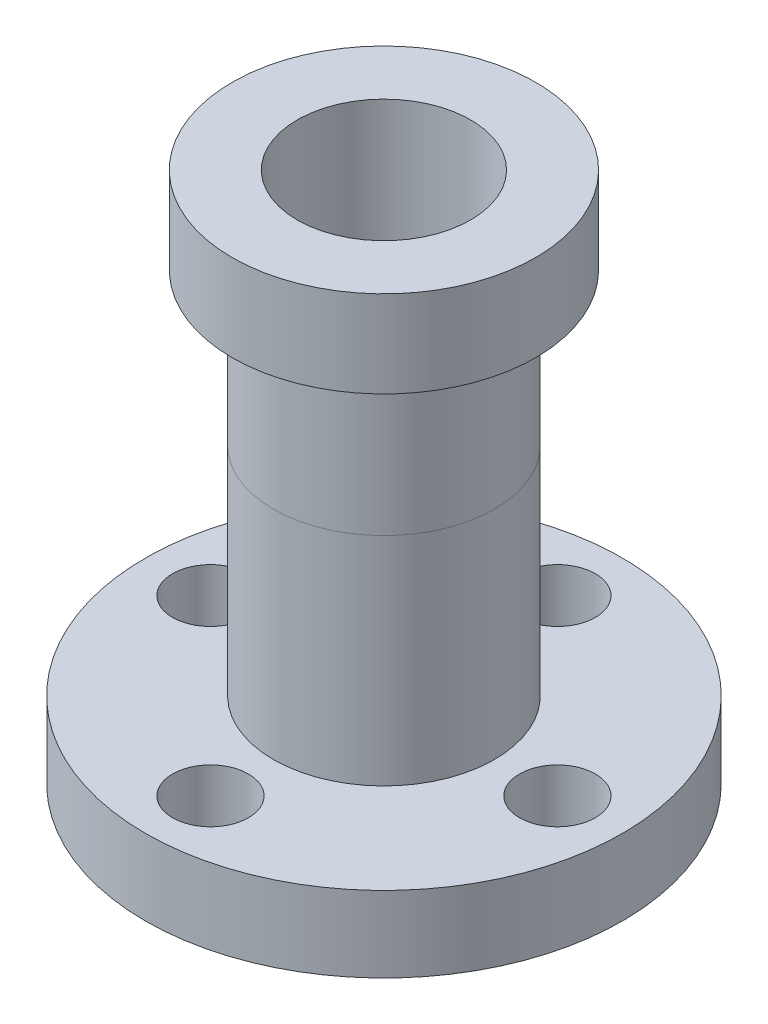
ISO-10303-21;
HEADER;
FILE_DESCRIPTION(('STEP AP214'),'2;1');
FILE_NAME('part.step','',(''),(''),'','','');
FILE_SCHEMA(('AUTOMOTIVE_DESIGN { 1 0 10303 214 1 1 1 1 }'));
ENDSEC;
DATA;
#1=APPLICATION_CONTEXT('core data for automotive mechanical design processes');
#2=APPLICATION_PROTOCOL_DEFINITION('international standard','automotive_design',2000,#1);
#3=PRODUCT_CONTEXT('',#1,'mechanical');
#4=PRODUCT('Part','Part','',(#3));
#5=PRODUCT_RELATED_PRODUCT_CATEGORY('part','',(#4));
#6=PRODUCT_DEFINITION_FORMATION('','',#4);
#7=PRODUCT_DEFINITION_CONTEXT('part definition',#1,'design');
#8=PRODUCT_DEFINITION('design','',#6,#7);
#9=PRODUCT_DEFINITION_SHAPE('','',#8);
#10=(LENGTH_UNIT() NAMED_UNIT(*) SI_UNIT(.MILLI.,.METRE.));
#11=(NAMED_UNIT(*) PLANE_ANGLE_UNIT() SI_UNIT($,.RADIAN.));
#12=(NAMED_UNIT(*) SI_UNIT($,.STERADIAN.) SOLID_ANGLE_UNIT());
#13=UNCERTAINTY_MEASURE_WITH_UNIT(LENGTH_MEASURE(1.E-05),#10,'distance_accuracy_value','');
#14=(GEOMETRIC_REPRESENTATION_CONTEXT(3) GLOBAL_UNCERTAINTY_ASSIGNED_CONTEXT((#13)) GLOBAL_UNIT_ASSIGNED_CONTEXT((#10,
#11,#12)) REPRESENTATION_CONTEXT('',''));
#15=CARTESIAN_POINT('',(0.,0.,0.));
#16=DIRECTION('',(0.,0.,1.));
#17=DIRECTION('',(1.,0.,0.));
#18=AXIS2_PLACEMENT_3D('',#15,#16,#17);
#19=CARTESIAN_POINT('',(0.,26.,0.));
#20=DIRECTION('',(0.,-1.,0.));
#21=DIRECTION('',(0.,0.,-1.));
#22=AXIS2_PLACEMENT_3D('',#19,#20,#21);
#23=CYLINDRICAL_SURFACE('',#22,5.1);
#24=CARTESIAN_POINT('',(0.,15.,0.));
#25=DIRECTION('',(0.,1.,0.));
#26=DIRECTION('',(0.,0.,1.));
#27=AXIS2_PLACEMENT_3D('',#24,#25,#26);
#28=CIRCLE('',#27,5.1);
#29=CARTESIAN_POINT('',(0.,15.,5.1));
#30=VERTEX_POINT('',#29);
#31=EDGE_CURVE('P0_E21',#30,#30,#28,.T.);
#32=ORIENTED_EDGE('',*,*,#31,.T.);
#33=EDGE_LOOP('',(#32));
#34=FACE_BOUND('',#33,.T.);
#35=CARTESIAN_POINT('',(0.,22.,0.));
#36=DIRECTION('',(0.,1.,0.));
#37=DIRECTION('',(0.,0.,1.));
#38=AXIS2_PLACEMENT_3D('',#35,#36,#37);
#39=CIRCLE('',#38,5.1);
#40=CARTESIAN_POINT('',(0.,22.,5.1));
#41=VERTEX_POINT('',#40);
#42=EDGE_CURVE('P0_E10',#41,#41,#39,.T.);
#43=ORIENTED_EDGE('',*,*,#42,.F.);
#44=EDGE_LOOP('',(#43));
#45=FACE_BOUND('',#44,.T.);
#46=ADVANCED_FACE('P0_F15',(#34,#45),#23,.T.);
#47=CARTESIAN_POINT('',(0.,26.,0.));
#48=DIRECTION('',(0.,1.,0.));
#49=DIRECTION('',(0.,0.,1.));
#50=AXIS2_PLACEMENT_3D('',#47,#48,#49);
#51=PLANE('',#50);
#52=CARTESIAN_POINT('',(0.,26.,0.));
#53=DIRECTION('',(0.,1.,0.));
#54=DIRECTION('',(0.,0.,1.));
#55=AXIS2_PLACEMENT_3D('',#52,#53,#54);
#56=CIRCLE('',#55,4.);
#57=CARTESIAN_POINT('',(0.,26.,4.));
#58=VERTEX_POINT('',#57);
#59=EDGE_CURVE('P0_E25',#58,#58,#56,.T.);
#60=ORIENTED_EDGE('',*,*,#59,.F.);
#61=EDGE_LOOP('',(#60));
#62=FACE_BOUND('',#61,.T.);
#63=CARTESIAN_POINT('',(0.,26.,0.));
#64=DIRECTION('',(0.,1.,0.));
#65=DIRECTION('',(0.,0.,1.));
#66=AXIS2_PLACEMENT_3D('',#63,#64,#65);
#67=CIRCLE('',#66,7.);
#68=CARTESIAN_POINT('',(0.,26.,7.));
#69=VERTEX_POINT('',#68);
#70=EDGE_CURVE('P0_E35',#69,#69,#67,.T.);
#71=ORIENTED_EDGE('',*,*,#70,.T.);
#72=EDGE_LOOP('',(#71));
#73=FACE_BOUND('',#72,.T.);
#74=ADVANCED_FACE('P0_F55',(#62,#73),#51,.T.);
#75=CARTESIAN_POINT('',(0.,15.,0.));
#76=DIRECTION('',(0.,1.,0.));
#77=DIRECTION('',(0.,0.,1.));
#78=AXIS2_PLACEMENT_3D('',#75,#76,#77);
#79=PLANE('',#78);
#80=ORIENTED_EDGE('',*,*,#31,.F.);
#81=EDGE_LOOP('',(#80));
#82=FACE_BOUND('',#81,.T.);
#83=CARTESIAN_POINT('',(0.,15.,0.));
#84=DIRECTION('',(0.,1.,0.));
#85=DIRECTION('',(0.,0.,1.));
#86=AXIS2_PLACEMENT_3D('',#83,#84,#85);
#87=CIRCLE('',#86,4.);
#88=CARTESIAN_POINT('',(0.,15.,4.));
#89=VERTEX_POINT('',#88);
#90=EDGE_CURVE('P0_E29',#89,#89,#87,.T.);
#91=ORIENTED_EDGE('',*,*,#90,.T.);
#92=EDGE_LOOP('',(#91));
#93=FACE_BOUND('',#92,.T.);
#94=ADVANCED_FACE('P0_F60',(#82,#93),#79,.F.);
#95=CARTESIAN_POINT('',(0.,26.,0.));
#96=DIRECTION('',(0.,-1.,0.));
#97=DIRECTION('',(0.,0.,-1.));
#98=AXIS2_PLACEMENT_3D('',#95,#96,#97);
#99=CYLINDRICAL_SURFACE('',#98,4.);
#100=ORIENTED_EDGE('',*,*,#59,.T.);
#101=EDGE_LOOP('',(#100));
#102=FACE_BOUND('',#101,.T.);
#103=ORIENTED_EDGE('',*,*,#90,.F.);
#104=EDGE_LOOP('',(#103));
#105=FACE_BOUND('',#104,.T.);
#106=ADVANCED_FACE('P0_F52',(#102,#105),#99,.F.);
#107=CARTESIAN_POINT('',(0.,22.,0.));
#108=DIRECTION('',(0.,1.,0.));
#109=DIRECTION('',(0.,0.,1.));
#110=AXIS2_PLACEMENT_3D('',#107,#108,#109);
#111=CYLINDRICAL_SURFACE('',#110,7.);
#112=CARTESIAN_POINT('',(0.,22.,0.));
#113=DIRECTION('',(0.,1.,0.));
#114=DIRECTION('',(0.,0.,1.));
#115=AXIS2_PLACEMENT_3D('',#112,#113,#114);
#116=CIRCLE('',#115,7.);
#117=CARTESIAN_POINT('',(0.,22.,7.));
#118=VERTEX_POINT('',#117);
#119=EDGE_CURVE('P0_E33',#118,#118,#116,.T.);
#120=ORIENTED_EDGE('',*,*,#119,.T.);
#121=EDGE_LOOP('',(#120));
#122=FACE_BOUND('',#121,.T.);
#123=ORIENTED_EDGE('',*,*,#70,.F.);
#124=EDGE_LOOP('',(#123));
#125=FACE_BOUND('',#124,.T.);
#126=ADVANCED_FACE('P0_F41',(#122,#125),#111,.T.);
#127=CARTESIAN_POINT('',(0.,22.,0.));
#128=DIRECTION('',(0.,1.,0.));
#129=DIRECTION('',(0.,0.,1.));
#130=AXIS2_PLACEMENT_3D('',#127,#128,#129);
#131=PLANE('',#130);
#132=ORIENTED_EDGE('',*,*,#42,.T.);
#133=EDGE_LOOP('',(#132));
#134=FACE_BOUND('',#133,.T.);
#135=ORIENTED_EDGE('',*,*,#119,.F.);
#136=EDGE_LOOP('',(#135));
#137=FACE_BOUND('',#136,.T.);
#138=ADVANCED_FACE('P0_F44',(#134,#137),#131,.F.);
#139=CLOSED_SHELL('',(#46,#74,#94,#106,#126,#138));
#140=MANIFOLD_SOLID_BREP('P0_B1',#139);
#141=CARTESIAN_POINT('',(0.,15.,0.));
#142=DIRECTION('',(0.,-1.,0.));
#143=DIRECTION('',(0.,0.,-1.));
#144=AXIS2_PLACEMENT_3D('',#141,#142,#143);
#145=CYLINDRICAL_SURFACE('',#144,4.);
#146=CARTESIAN_POINT('',(0.,15.,0.));
#147=DIRECTION('',(0.,1.,0.));
#148=DIRECTION('',(0.,0.,1.));
#149=AXIS2_PLACEMENT_3D('',#146,#147,#148);
#150=CIRCLE('',#149,4.);
#151=CARTESIAN_POINT('',(0.,15.,4.));
#152=VERTEX_POINT('',#151);
#153=EDGE_CURVE('P1_E10',#152,#152,#150,.T.);
#154=ORIENTED_EDGE('',*,*,#153,.T.);
#155=EDGE_LOOP('',(#154));
#156=FACE_BOUND('',#155,.T.);
#157=CARTESIAN_POINT('',(0.,1.5,0.));
#158=DIRECTION('',(0.,-1.,0.));
#159=DIRECTION('',(0.,0.,-1.));
#160=AXIS2_PLACEMENT_3D('',#157,#158,#159);
#161=CIRCLE('',#160,4.);
#162=CARTESIAN_POINT('',(0.,1.5,-4.));
#163=VERTEX_POINT('',#162);
#164=EDGE_CURVE('P1_E63',#163,#163,#161,.T.);
#165=ORIENTED_EDGE('',*,*,#164,.T.);
#166=EDGE_LOOP('',(#165));
#167=FACE_BOUND('',#166,.T.);
#168=ADVANCED_FACE('P1_F15',(#156,#167),#145,.F.);
#169=CARTESIAN_POINT('',(0.,15.,0.));
#170=DIRECTION('',(0.,-1.,0.));
#171=DIRECTION('',(0.,0.,-1.));
#172=AXIS2_PLACEMENT_3D('',#169,#170,#171);
#173=CYLINDRICAL_SURFACE('',#172,11.);
#174=CARTESIAN_POINT('',(0.,1.5,0.));
#175=DIRECTION('',(0.,1.,0.));
#176=DIRECTION('',(0.,0.,1.));
#177=AXIS2_PLACEMENT_3D('',#174,#175,#176);
#178=CIRCLE('',#177,11.);
#179=CARTESIAN_POINT('',(0.,1.5,11.));
#180=VERTEX_POINT('',#179);
#181=EDGE_CURVE('P1_E23',#180,#180,#178,.T.);
#182=ORIENTED_EDGE('',*,*,#181,.T.);
#183=EDGE_LOOP('',(#182));
#184=FACE_BOUND('',#183,.T.);
#185=CARTESIAN_POINT('',(0.,5.,0.));
#186=DIRECTION('',(0.,1.,0.));
#187=DIRECTION('',(0.,0.,1.));
#188=AXIS2_PLACEMENT_3D('',#185,#186,#187);
#189=CIRCLE('',#188,11.);
#190=CARTESIAN_POINT('',(0.,5.,11.));
#191=VERTEX_POINT('',#190);
#192=EDGE_CURVE('P1_E28',#191,#191,#189,.T.);
#193=ORIENTED_EDGE('',*,*,#192,.F.);
#194=EDGE_LOOP('',(#193));
#195=FACE_BOUND('',#194,.T.);
#196=ADVANCED_FACE('P1_F17',(#184,#195),#173,.T.);
#197=CARTESIAN_POINT('',(0.,15.,0.));
#198=DIRECTION('',(0.,1.,0.));
#199=DIRECTION('',(0.,0.,1.));
#200=AXIS2_PLACEMENT_3D('',#197,#198,#199);
#201=PLANE('',#200);
#202=CARTESIAN_POINT('',(0.,15.,0.));
#203=DIRECTION('',(0.,1.,0.));
#204=DIRECTION('',(0.,0.,1.));
#205=AXIS2_PLACEMENT_3D('',#202,#203,#204);
#206=CIRCLE('',#205,5.1);
#207=CARTESIAN_POINT('',(0.,15.,5.1));
#208=VERTEX_POINT('',#207);
#209=EDGE_CURVE('P1_E34',#208,#208,#206,.T.);
#210=ORIENTED_EDGE('',*,*,#209,.T.);
#211=EDGE_LOOP('',(#210));
#212=FACE_BOUND('',#211,.T.);
#213=ORIENTED_EDGE('',*,*,#153,.F.);
#214=EDGE_LOOP('',(#213));
#215=FACE_BOUND('',#214,.T.);
#216=ADVANCED_FACE('P1_F71',(#212,#215),#201,.T.);
#217=CARTESIAN_POINT('',(0.,1.5,0.));
#218=DIRECTION('',(0.,1.,0.));
#219=DIRECTION('',(0.,0.,1.));
#220=AXIS2_PLACEMENT_3D('',#217,#218,#219);
#221=PLANE('',#220);
#222=CARTESIAN_POINT('',(0.,1.5,-8.));
#223=DIRECTION('',(0.,1.,0.));
#224=DIRECTION('',(0.,0.,1.));
#225=AXIS2_PLACEMENT_3D('',#222,#223,#224);
#226=CIRCLE('',#225,1.75);
#227=CARTESIAN_POINT('',(0.,1.5,-6.25));
#228=VERTEX_POINT('',#227);
#229=EDGE_CURVE('P1_E57',#228,#228,#226,.T.);
#230=ORIENTED_EDGE('',*,*,#229,.T.);
#231=EDGE_LOOP('',(#230));
#232=FACE_BOUND('',#231,.T.);
#233=CARTESIAN_POINT('',(8.,1.5,0.));
#234=DIRECTION('',(0.,1.,0.));
#235=DIRECTION('',(0.,0.,1.));
#236=AXIS2_PLACEMENT_3D('',#233,#234,#235);
#237=CIRCLE('',#236,1.75);
#238=CARTESIAN_POINT('',(8.,1.5,1.75));
#239=VERTEX_POINT('',#238);
#240=EDGE_CURVE('P1_E51',#239,#239,#237,.T.);
#241=ORIENTED_EDGE('',*,*,#240,.T.);
#242=EDGE_LOOP('',(#241));
#243=FACE_BOUND('',#242,.T.);
#244=CARTESIAN_POINT('',(0.,1.5,8.));
#245=DIRECTION('',(0.,1.,0.));
#246=DIRECTION('',(0.,0.,1.));
#247=AXIS2_PLACEMENT_3D('',#244,#245,#246);
#248=CIRCLE('',#247,1.75);
#249=CARTESIAN_POINT('',(0.,1.5,9.75));
#250=VERTEX_POINT('',#249);
#251=EDGE_CURVE('P1_E19',#250,#250,#248,.T.);
#252=ORIENTED_EDGE('',*,*,#251,.T.);
#253=EDGE_LOOP('',(#252));
#254=FACE_BOUND('',#253,.T.);
#255=CARTESIAN_POINT('',(-8.,1.5,0.));
#256=DIRECTION('',(0.,1.,0.));
#257=DIRECTION('',(0.,0.,1.));
#258=AXIS2_PLACEMENT_3D('',#255,#256,#257);
#259=CIRCLE('',#258,1.75);
#260=CARTESIAN_POINT('',(-8.,1.5,1.75));
#261=VERTEX_POINT('',#260);
#262=EDGE_CURVE('P1_E41',#261,#261,#259,.T.);
#263=ORIENTED_EDGE('',*,*,#262,.T.);
#264=EDGE_LOOP('',(#263));
#265=FACE_BOUND('',#264,.T.);
#266=ORIENTED_EDGE('',*,*,#181,.F.);
#267=EDGE_LOOP('',(#266));
#268=FACE_BOUND('',#267,.T.);
#269=ORIENTED_EDGE('',*,*,#164,.F.);
#270=EDGE_LOOP('',(#269));
#271=FACE_BOUND('',#270,.T.);
#272=ADVANCED_FACE('P1_F68',(#232,#243,#254,#265,#268,#271),#221,.F.);
#273=CARTESIAN_POINT('',(0.,5.,0.));
#274=DIRECTION('',(0.,1.,0.));
#275=DIRECTION('',(0.,0.,1.));
#276=AXIS2_PLACEMENT_3D('',#273,#274,#275);
#277=PLANE('',#276);
#278=CARTESIAN_POINT('',(0.,5.,-8.));
#279=DIRECTION('',(0.,1.,0.));
#280=DIRECTION('',(0.,0.,1.));
#281=AXIS2_PLACEMENT_3D('',#278,#279,#280);
#282=CIRCLE('',#281,1.75);
#283=CARTESIAN_POINT('',(0.,5.,-6.25));
#284=VERTEX_POINT('',#283);
#285=EDGE_CURVE('P1_E60',#284,#284,#282,.T.);
#286=ORIENTED_EDGE('',*,*,#285,.F.);
#287=EDGE_LOOP('',(#286));
#288=FACE_BOUND('',#287,.T.);
#289=CARTESIAN_POINT('',(8.,5.,0.));
#290=DIRECTION('',(0.,1.,0.));
#291=DIRECTION('',(0.,0.,1.));
#292=AXIS2_PLACEMENT_3D('',#289,#290,#291);
#293=CIRCLE('',#292,1.75);
#294=CARTESIAN_POINT('',(8.,5.,1.75));
#295=VERTEX_POINT('',#294);
#296=EDGE_CURVE('P1_E54',#295,#295,#293,.T.);
#297=ORIENTED_EDGE('',*,*,#296,.F.);
#298=EDGE_LOOP('',(#297));
#299=FACE_BOUND('',#298,.T.);
#300=CARTESIAN_POINT('',(0.,5.,8.));
#301=DIRECTION('',(0.,1.,0.));
#302=DIRECTION('',(0.,0.,1.));
#303=AXIS2_PLACEMENT_3D('',#300,#301,#302);
#304=CIRCLE('',#303,1.75);
#305=CARTESIAN_POINT('',(0.,5.,9.75));
#306=VERTEX_POINT('',#305);
#307=EDGE_CURVE('P1_E48',#306,#306,#304,.T.);
#308=ORIENTED_EDGE('',*,*,#307,.F.);
#309=EDGE_LOOP('',(#308));
#310=FACE_BOUND('',#309,.T.);
#311=CARTESIAN_POINT('',(-8.,5.,0.));
#312=DIRECTION('',(0.,1.,0.));
#313=DIRECTION('',(0.,0.,1.));
#314=AXIS2_PLACEMENT_3D('',#311,#312,#313);
#315=CIRCLE('',#314,1.75);
#316=CARTESIAN_POINT('',(-8.,5.,1.75));
#317=VERTEX_POINT('',#316);
#318=EDGE_CURVE('P1_E45',#317,#317,#315,.T.);
#319=ORIENTED_EDGE('',*,*,#318,.F.);
#320=EDGE_LOOP('',(#319));
#321=FACE_BOUND('',#320,.T.);
#322=CARTESIAN_POINT('',(0.,5.,0.));
#323=DIRECTION('',(0.,1.,0.));
#324=DIRECTION('',(0.,0.,1.));
#325=AXIS2_PLACEMENT_3D('',#322,#323,#324);
#326=CIRCLE('',#325,5.1);
#327=CARTESIAN_POINT('',(0.,5.,5.1));
#328=VERTEX_POINT('',#327);
#329=EDGE_CURVE('P1_E31',#328,#328,#326,.T.);
#330=ORIENTED_EDGE('',*,*,#329,.F.);
#331=EDGE_LOOP('',(#330));
#332=FACE_BOUND('',#331,.T.);
#333=ORIENTED_EDGE('',*,*,#192,.T.);
#334=EDGE_LOOP('',(#333));
#335=FACE_BOUND('',#334,.T.);
#336=ADVANCED_FACE('P1_F70',(#288,#299,#310,#321,#332,#335),#277,.T.);
#337=CARTESIAN_POINT('',(0.,15.,0.));
#338=DIRECTION('',(0.,-1.,0.));
#339=DIRECTION('',(0.,0.,-1.));
#340=AXIS2_PLACEMENT_3D('',#337,#338,#339);
#341=CYLINDRICAL_SURFACE('',#340,5.1);
#342=ORIENTED_EDGE('',*,*,#209,.F.);
#343=EDGE_LOOP('',(#342));
#344=FACE_BOUND('',#343,.T.);
#345=ORIENTED_EDGE('',*,*,#329,.T.);
#346=EDGE_LOOP('',(#345));
#347=FACE_BOUND('',#346,.T.);
#348=ADVANCED_FACE('P1_F80',(#344,#347),#341,.T.);
#349=CARTESIAN_POINT('',(-8.,5.,0.));
#350=DIRECTION('',(0.,1.,0.));
#351=DIRECTION('',(0.,0.,1.));
#352=AXIS2_PLACEMENT_3D('',#349,#350,#351);
#353=CYLINDRICAL_SURFACE('',#352,1.75);
#354=ORIENTED_EDGE('',*,*,#318,.T.);
#355=EDGE_LOOP('',(#354));
#356=FACE_BOUND('',#355,.T.);
#357=ORIENTED_EDGE('',*,*,#262,.F.);
#358=EDGE_LOOP('',(#357));
#359=FACE_BOUND('',#358,.T.);
#360=ADVANCED_FACE('P1_F125',(#356,#359),#353,.F.);
#361=CARTESIAN_POINT('',(0.,5.,8.));
#362=DIRECTION('',(0.,1.,0.));
#363=DIRECTION('',(0.,0.,1.));
#364=AXIS2_PLACEMENT_3D('',#361,#362,#363);
#365=CYLINDRICAL_SURFACE('',#364,1.75);
#366=ORIENTED_EDGE('',*,*,#307,.T.);
#367=EDGE_LOOP('',(#366));
#368=FACE_BOUND('',#367,.T.);
#369=ORIENTED_EDGE('',*,*,#251,.F.);
#370=EDGE_LOOP('',(#369));
#371=FACE_BOUND('',#370,.T.);
#372=ADVANCED_FACE('P1_F135',(#368,#371),#365,.F.);
#373=CARTESIAN_POINT('',(8.,5.,0.));
#374=DIRECTION('',(0.,1.,0.));
#375=DIRECTION('',(0.,0.,1.));
#376=AXIS2_PLACEMENT_3D('',#373,#374,#375);
#377=CYLINDRICAL_SURFACE('',#376,1.75);
#378=ORIENTED_EDGE('',*,*,#296,.T.);
#379=EDGE_LOOP('',(#378));
#380=FACE_BOUND('',#379,.T.);
#381=ORIENTED_EDGE('',*,*,#240,.F.);
#382=EDGE_LOOP('',(#381));
#383=FACE_BOUND('',#382,.T.);
#384=ADVANCED_FACE('P1_F145',(#380,#383),#377,.F.);
#385=CARTESIAN_POINT('',(0.,5.,-8.));
#386=DIRECTION('',(0.,1.,0.));
#387=DIRECTION('',(0.,0.,1.));
#388=AXIS2_PLACEMENT_3D('',#385,#386,#387);
#389=CYLINDRICAL_SURFACE('',#388,1.75);
#390=ORIENTED_EDGE('',*,*,#285,.T.);
#391=EDGE_LOOP('',(#390));
#392=FACE_BOUND('',#391,.T.);
#393=ORIENTED_EDGE('',*,*,#229,.F.);
#394=EDGE_LOOP('',(#393));
#395=FACE_BOUND('',#394,.T.);
#396=ADVANCED_FACE('P1_F155',(#392,#395),#389,.F.);
#397=CLOSED_SHELL('',(#168,#196,#216,#272,#336,#348,#360,#372,#384,#396));
#398=MANIFOLD_SOLID_BREP('P1_B1',#397);
#399=ADVANCED_BREP_SHAPE_REPRESENTATION('',(#18,#140,#398),#14);
#400=SHAPE_DEFINITION_REPRESENTATION(#9,#399);
ENDSEC;
END-ISO-10303-21;
